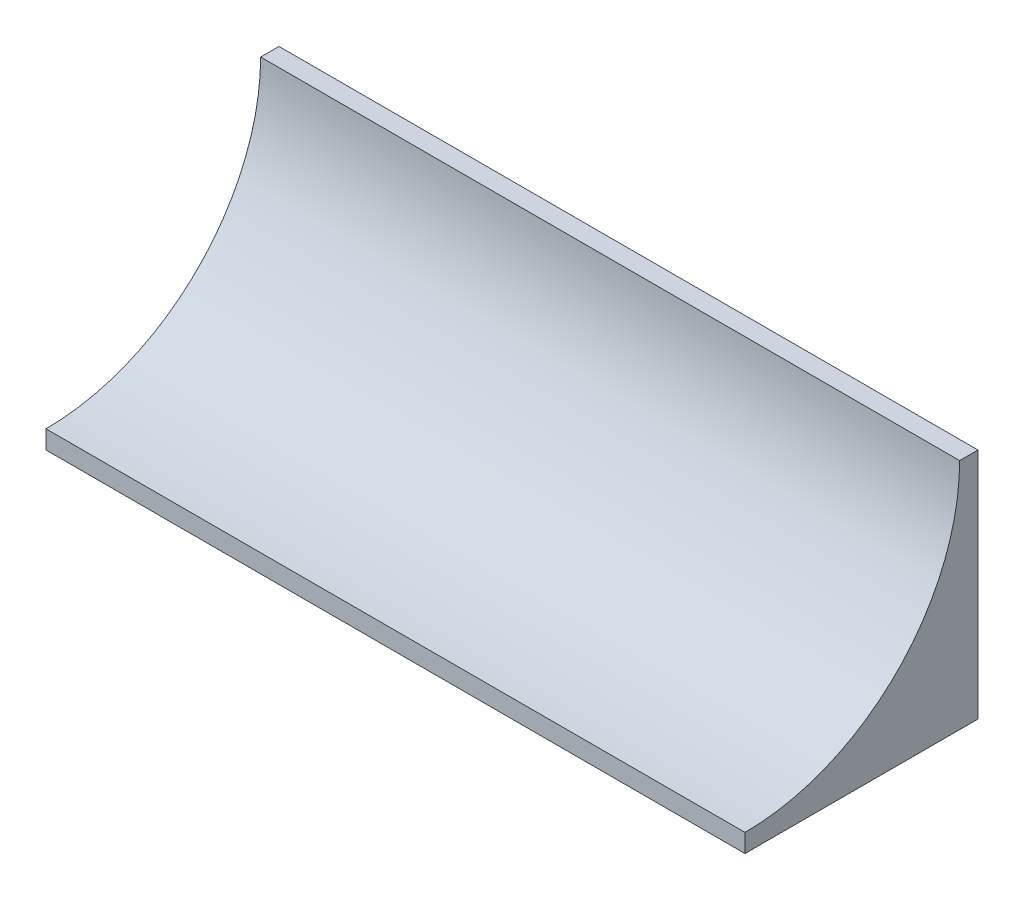
ISO-10303-21;
HEADER;
FILE_DESCRIPTION(('STEP AP214'),'2;1');
FILE_NAME('part.step','',(''),(''),'','','');
FILE_SCHEMA(('AUTOMOTIVE_DESIGN { 1 0 10303 214 1 1 1 1 }'));
ENDSEC;
DATA;
#1=APPLICATION_CONTEXT('core data for automotive mechanical design processes');
#2=APPLICATION_PROTOCOL_DEFINITION('international standard','automotive_design',2000,#1);
#3=PRODUCT_CONTEXT('',#1,'mechanical');
#4=PRODUCT('Part','Part','',(#3));
#5=PRODUCT_RELATED_PRODUCT_CATEGORY('part','',(#4));
#6=PRODUCT_DEFINITION_FORMATION('','',#4);
#7=PRODUCT_DEFINITION_CONTEXT('part definition',#1,'design');
#8=PRODUCT_DEFINITION('design','',#6,#7);
#9=PRODUCT_DEFINITION_SHAPE('','',#8);
#10=(LENGTH_UNIT() NAMED_UNIT(*) SI_UNIT(.MILLI.,.METRE.));
#11=(NAMED_UNIT(*) PLANE_ANGLE_UNIT() SI_UNIT($,.RADIAN.));
#12=(NAMED_UNIT(*) SI_UNIT($,.STERADIAN.) SOLID_ANGLE_UNIT());
#13=UNCERTAINTY_MEASURE_WITH_UNIT(LENGTH_MEASURE(1.E-05),#10,'distance_accuracy_value','');
#14=(GEOMETRIC_REPRESENTATION_CONTEXT(3) GLOBAL_UNCERTAINTY_ASSIGNED_CONTEXT((#13)) GLOBAL_UNIT_ASSIGNED_CONTEXT((#10,
#11,#12)) REPRESENTATION_CONTEXT('',''));
#15=CARTESIAN_POINT('',(0.,0.,0.));
#16=DIRECTION('',(0.,0.,1.));
#17=DIRECTION('',(1.,0.,0.));
#18=AXIS2_PLACEMENT_3D('',#15,#16,#17);
#19=CARTESIAN_POINT('',(76.2,-25.4,25.4));
#20=DIRECTION('',(0.,1.,0.));
#21=DIRECTION('',(0.,0.,1.));
#22=AXIS2_PLACEMENT_3D('',#19,#20,#21);
#23=PLANE('',#22);
#24=DIRECTION('',(1.,0.,0.));
#25=VECTOR('',#24,1.);
#26=CARTESIAN_POINT('',(-71.8420489685532,-25.4,1.69309011255337E-13));
#27=LINE('',#26,#25);
#28=CARTESIAN_POINT('',(0.,-25.4,1.69309008608358E-13));
#29=VERTEX_POINT('',#28);
#30=CARTESIAN_POINT('',(76.2,-25.4,1.69309011255337E-13));
#31=VERTEX_POINT('',#30);
#32=EDGE_CURVE('E113',#29,#31,#27,.T.);
#33=ORIENTED_EDGE('',*,*,#32,.F.);
#34=DIRECTION('',(0.,0.,-1.));
#35=VECTOR('',#34,1.);
#36=CARTESIAN_POINT('',(0.,-25.4,25.4));
#37=LINE('',#36,#35);
#38=CARTESIAN_POINT('',(0.,-25.4,-25.4));
#39=VERTEX_POINT('',#38);
#40=EDGE_CURVE('E119',#29,#39,#37,.T.);
#41=ORIENTED_EDGE('',*,*,#40,.T.);
#42=DIRECTION('',(-1.,0.,0.));
#43=VECTOR('',#42,1.);
#44=CARTESIAN_POINT('',(76.2,-25.4,-25.4));
#45=LINE('',#44,#43);
#46=CARTESIAN_POINT('',(76.2,-25.4,-25.4));
#47=VERTEX_POINT('',#46);
#48=EDGE_CURVE('E11',#47,#39,#45,.T.);
#49=ORIENTED_EDGE('',*,*,#48,.F.);
#50=DIRECTION('',(0.,0.,-1.));
#51=VECTOR('',#50,1.);
#52=CARTESIAN_POINT('',(76.2,-25.4,25.4));
#53=LINE('',#52,#51);
#54=EDGE_CURVE('E43',#31,#47,#53,.T.);
#55=ORIENTED_EDGE('',*,*,#54,.F.);
#56=EDGE_LOOP('',(#33,#41,#49,#55));
#57=FACE_BOUND('',#56,.T.);
#58=ADVANCED_FACE('F35',(#57),#23,.F.);
#59=CARTESIAN_POINT('',(76.2,-25.4,-25.4));
#60=DIRECTION('',(0.,0.,1.));
#61=DIRECTION('',(1.,0.,0.));
#62=AXIS2_PLACEMENT_3D('',#59,#60,#61);
#63=PLANE('',#62);
#64=DIRECTION('',(0.,1.,0.));
#65=VECTOR('',#64,1.);
#66=CARTESIAN_POINT('',(0.,-25.4,-25.4));
#67=LINE('',#66,#65);
#68=CARTESIAN_POINT('',(0.,0.,-25.4));
#69=VERTEX_POINT('',#68);
#70=EDGE_CURVE('E121',#39,#69,#67,.T.);
#71=ORIENTED_EDGE('',*,*,#70,.T.);
#72=DIRECTION('',(1.,0.,0.));
#73=VECTOR('',#72,1.);
#74=CARTESIAN_POINT('',(-71.8420489685532,0.,-25.4));
#75=LINE('',#74,#73);
#76=CARTESIAN_POINT('',(76.2,0.,-25.4));
#77=VERTEX_POINT('',#76);
#78=EDGE_CURVE('E88',#69,#77,#75,.T.);
#79=ORIENTED_EDGE('',*,*,#78,.T.);
#80=DIRECTION('',(0.,1.,0.));
#81=VECTOR('',#80,1.);
#82=CARTESIAN_POINT('',(76.2,-25.4,-25.4));
#83=LINE('',#82,#81);
#84=EDGE_CURVE('E117',#47,#77,#83,.T.);
#85=ORIENTED_EDGE('',*,*,#84,.F.);
#86=ORIENTED_EDGE('',*,*,#48,.T.);
#87=EDGE_LOOP('',(#71,#79,#85,#86));
#88=FACE_BOUND('',#87,.T.);
#89=ADVANCED_FACE('F37',(#88),#63,.F.);
#90=CARTESIAN_POINT('',(76.2,0.,0.));
#91=DIRECTION('',(-1.,0.,0.));
#92=DIRECTION('',(0.,0.,1.));
#93=AXIS2_PLACEMENT_3D('',#90,#91,#92);
#94=PLANE('',#93);
#95=ORIENTED_EDGE('',*,*,#84,.T.);
#96=DIRECTION('',(0.,0.,-1.));
#97=VECTOR('',#96,1.);
#98=CARTESIAN_POINT('',(76.2,0.,0.));
#99=LINE('',#98,#97);
#100=CARTESIAN_POINT('',(76.2,0.,-23.4));
#101=VERTEX_POINT('',#100);
#102=EDGE_CURVE('E105',#101,#77,#99,.T.);
#103=ORIENTED_EDGE('',*,*,#102,.F.);
#104=CARTESIAN_POINT('',(76.2,0.,0.));
#105=DIRECTION('',(1.,0.,0.));
#106=DIRECTION('',(0.,0.,-1.));
#107=AXIS2_PLACEMENT_3D('',#104,#105,#106);
#108=CIRCLE('',#107,23.4);
#109=CARTESIAN_POINT('',(76.2,-23.4,1.6237011735143E-13));
#110=VERTEX_POINT('',#109);
#111=EDGE_CURVE('E99',#110,#101,#108,.T.);
#112=ORIENTED_EDGE('',*,*,#111,.F.);
#113=DIRECTION('',(0.,-1.,0.));
#114=VECTOR('',#113,1.);
#115=CARTESIAN_POINT('',(76.2,0.,0.));
#116=LINE('',#115,#114);
#117=EDGE_CURVE('E110',#110,#31,#116,.T.);
#118=ORIENTED_EDGE('',*,*,#117,.T.);
#119=ORIENTED_EDGE('',*,*,#54,.T.);
#120=EDGE_LOOP('',(#95,#103,#112,#118,#119));
#121=FACE_BOUND('',#120,.T.);
#122=ADVANCED_FACE('F126',(#121),#94,.F.);
#123=CARTESIAN_POINT('',(0.,0.,0.));
#124=DIRECTION('',(-1.,0.,0.));
#125=DIRECTION('',(0.,0.,1.));
#126=AXIS2_PLACEMENT_3D('',#123,#124,#125);
#127=PLANE('',#126);
#128=DIRECTION('',(0.,0.,-1.));
#129=VECTOR('',#128,1.);
#130=CARTESIAN_POINT('',(0.,0.,0.));
#131=LINE('',#130,#129);
#132=CARTESIAN_POINT('',(0.,0.,-23.4));
#133=VERTEX_POINT('',#132);
#134=EDGE_CURVE('E82',#133,#69,#131,.T.);
#135=ORIENTED_EDGE('',*,*,#134,.T.);
#136=ORIENTED_EDGE('',*,*,#70,.F.);
#137=ORIENTED_EDGE('',*,*,#40,.F.);
#138=DIRECTION('',(0.,-1.,0.));
#139=VECTOR('',#138,1.);
#140=CARTESIAN_POINT('',(0.,0.,0.));
#141=LINE('',#140,#139);
#142=CARTESIAN_POINT('',(0.,-23.4,1.6237011735143E-13));
#143=VERTEX_POINT('',#142);
#144=EDGE_CURVE('E104',#143,#29,#141,.T.);
#145=ORIENTED_EDGE('',*,*,#144,.F.);
#146=CARTESIAN_POINT('',(0.,0.,0.));
#147=DIRECTION('',(-1.,0.,0.));
#148=DIRECTION('',(0.,0.,1.));
#149=AXIS2_PLACEMENT_3D('',#146,#147,#148);
#150=CIRCLE('',#149,23.4);
#151=EDGE_CURVE('E96',#143,#133,#150,.F.);
#152=ORIENTED_EDGE('',*,*,#151,.T.);
#153=EDGE_LOOP('',(#135,#136,#137,#145,#152));
#154=FACE_BOUND('',#153,.T.);
#155=ADVANCED_FACE('F102',(#154),#127,.T.);
#156=CARTESIAN_POINT('',(-71.8420489685532,0.,0.));
#157=DIRECTION('',(1.,0.,0.));
#158=DIRECTION('',(0.,0.,-1.));
#159=AXIS2_PLACEMENT_3D('',#156,#157,#158);
#160=CYLINDRICAL_SURFACE('',#159,23.4);
#161=DIRECTION('',(1.,0.,0.));
#162=VECTOR('',#161,1.);
#163=CARTESIAN_POINT('',(-71.8420489685532,-23.4,1.6237011735143E-13));
#164=LINE('',#163,#162);
#165=EDGE_CURVE('E50',#143,#110,#164,.T.);
#166=ORIENTED_EDGE('',*,*,#165,.T.);
#167=ORIENTED_EDGE('',*,*,#111,.T.);
#168=DIRECTION('',(1.,0.,0.));
#169=VECTOR('',#168,1.);
#170=CARTESIAN_POINT('',(-71.8420489685532,0.,-23.4));
#171=LINE('',#170,#169);
#172=EDGE_CURVE('E85',#133,#101,#171,.T.);
#173=ORIENTED_EDGE('',*,*,#172,.F.);
#174=ORIENTED_EDGE('',*,*,#151,.F.);
#175=EDGE_LOOP('',(#166,#167,#173,#174));
#176=FACE_BOUND('',#175,.T.);
#177=ADVANCED_FACE('F95',(#176),#160,.F.);
#178=CARTESIAN_POINT('',(-71.8420489685532,0.,0.));
#179=DIRECTION('',(0.,-1.,0.));
#180=DIRECTION('',(0.,0.,-1.));
#181=AXIS2_PLACEMENT_3D('',#178,#179,#180);
#182=PLANE('',#181);
#183=ORIENTED_EDGE('',*,*,#172,.T.);
#184=ORIENTED_EDGE('',*,*,#102,.T.);
#185=ORIENTED_EDGE('',*,*,#78,.F.);
#186=ORIENTED_EDGE('',*,*,#134,.F.);
#187=EDGE_LOOP('',(#183,#184,#185,#186));
#188=FACE_BOUND('',#187,.T.);
#189=ADVANCED_FACE('F84',(#188),#182,.F.);
#190=CARTESIAN_POINT('',(-71.8420489685532,0.,0.));
#191=DIRECTION('',(0.,0.,1.));
#192=DIRECTION('',(0.,-1.,0.));
#193=AXIS2_PLACEMENT_3D('',#190,#191,#192);
#194=PLANE('',#193);
#195=ORIENTED_EDGE('',*,*,#144,.T.);
#196=ORIENTED_EDGE('',*,*,#32,.T.);
#197=ORIENTED_EDGE('',*,*,#117,.F.);
#198=ORIENTED_EDGE('',*,*,#165,.F.);
#199=EDGE_LOOP('',(#195,#196,#197,#198));
#200=FACE_BOUND('',#199,.T.);
#201=ADVANCED_FACE('F127',(#200),#194,.T.);
#202=CLOSED_SHELL('',(#58,#89,#122,#155,#177,#189,#201));
#203=MANIFOLD_SOLID_BREP('B2',#202);
#204=ADVANCED_BREP_SHAPE_REPRESENTATION('',(#18,#203),#14);
#205=SHAPE_DEFINITION_REPRESENTATION(#9,#204);
ENDSEC;
END-ISO-10303-21;
